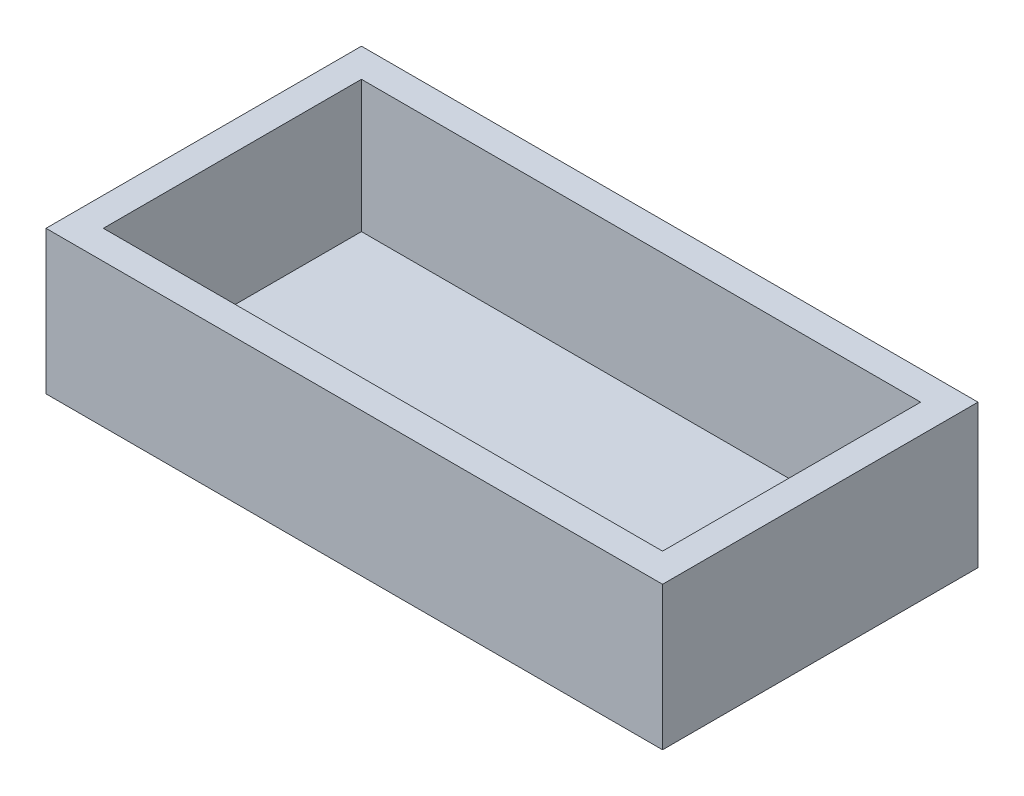
ISO-10303-21;
HEADER;
FILE_DESCRIPTION(('STEP AP214'),'2;1');
FILE_NAME('part.step','',(''),(''),'','','');
FILE_SCHEMA(('AUTOMOTIVE_DESIGN { 1 0 10303 214 1 1 1 1 }'));
ENDSEC;
DATA;
#1=APPLICATION_CONTEXT('core data for automotive mechanical design processes');
#2=APPLICATION_PROTOCOL_DEFINITION('international standard','automotive_design',2000,#1);
#3=PRODUCT_CONTEXT('',#1,'mechanical');
#4=PRODUCT('Part','Part','',(#3));
#5=PRODUCT_RELATED_PRODUCT_CATEGORY('part','',(#4));
#6=PRODUCT_DEFINITION_FORMATION('','',#4);
#7=PRODUCT_DEFINITION_CONTEXT('part definition',#1,'design');
#8=PRODUCT_DEFINITION('design','',#6,#7);
#9=PRODUCT_DEFINITION_SHAPE('','',#8);
#10=(LENGTH_UNIT() NAMED_UNIT(*) SI_UNIT(.MILLI.,.METRE.));
#11=(NAMED_UNIT(*) PLANE_ANGLE_UNIT() SI_UNIT($,.RADIAN.));
#12=(NAMED_UNIT(*) SI_UNIT($,.STERADIAN.) SOLID_ANGLE_UNIT());
#13=UNCERTAINTY_MEASURE_WITH_UNIT(LENGTH_MEASURE(1.E-05),#10,'distance_accuracy_value','');
#14=(GEOMETRIC_REPRESENTATION_CONTEXT(3) GLOBAL_UNCERTAINTY_ASSIGNED_CONTEXT((#13)) GLOBAL_UNIT_ASSIGNED_CONTEXT((#10,
#11,#12)) REPRESENTATION_CONTEXT('',''));
#15=CARTESIAN_POINT('',(0.,0.,0.));
#16=DIRECTION('',(0.,0.,1.));
#17=DIRECTION('',(1.,0.,0.));
#18=AXIS2_PLACEMENT_3D('',#15,#16,#17);
#19=CARTESIAN_POINT('',(21.5,10.,11.));
#20=DIRECTION('',(-1.,0.,0.));
#21=DIRECTION('',(0.,0.,1.));
#22=AXIS2_PLACEMENT_3D('',#19,#20,#21);
#23=PLANE('',#22);
#24=DIRECTION('',(0.,0.,-1.));
#25=VECTOR('',#24,1.);
#26=CARTESIAN_POINT('',(21.5,0.,11.));
#27=LINE('',#26,#25);
#28=CARTESIAN_POINT('',(21.5,0.,11.));
#29=VERTEX_POINT('',#28);
#30=CARTESIAN_POINT('',(21.5,0.,-11.));
#31=VERTEX_POINT('',#30);
#32=EDGE_CURVE('E180',#29,#31,#27,.T.);
#33=ORIENTED_EDGE('',*,*,#32,.T.);
#34=DIRECTION('',(0.,-1.,0.));
#35=VECTOR('',#34,1.);
#36=CARTESIAN_POINT('',(21.5,10.,-11.));
#37=LINE('',#36,#35);
#38=CARTESIAN_POINT('',(21.5,10.,-11.));
#39=VERTEX_POINT('',#38);
#40=EDGE_CURVE('E11',#39,#31,#37,.T.);
#41=ORIENTED_EDGE('',*,*,#40,.F.);
#42=DIRECTION('',(0.,0.,-1.));
#43=VECTOR('',#42,1.);
#44=CARTESIAN_POINT('',(21.5,10.,11.));
#45=LINE('',#44,#43);
#46=CARTESIAN_POINT('',(21.5,10.,11.));
#47=VERTEX_POINT('',#46);
#48=EDGE_CURVE('E188',#47,#39,#45,.T.);
#49=ORIENTED_EDGE('',*,*,#48,.F.);
#50=DIRECTION('',(0.,-1.,0.));
#51=VECTOR('',#50,1.);
#52=CARTESIAN_POINT('',(21.5,10.,11.));
#53=LINE('',#52,#51);
#54=EDGE_CURVE('E198',#47,#29,#53,.T.);
#55=ORIENTED_EDGE('',*,*,#54,.T.);
#56=EDGE_LOOP('',(#33,#41,#49,#55));
#57=FACE_BOUND('',#56,.T.);
#58=ADVANCED_FACE('F35',(#57),#23,.F.);
#59=CARTESIAN_POINT('',(-21.5,10.,-11.));
#60=DIRECTION('',(0.,0.,1.));
#61=DIRECTION('',(1.,0.,0.));
#62=AXIS2_PLACEMENT_3D('',#59,#60,#61);
#63=PLANE('',#62);
#64=DIRECTION('',(1.,0.,0.));
#65=VECTOR('',#64,1.);
#66=CARTESIAN_POINT('',(19.5,3.6,-11.));
#67=LINE('',#66,#65);
#68=CARTESIAN_POINT('',(16.3,3.6,-11.));
#69=VERTEX_POINT('',#68);
#70=CARTESIAN_POINT('',(19.5,3.6,-11.));
#71=VERTEX_POINT('',#70);
#72=EDGE_CURVE('E135',#69,#71,#67,.T.);
#73=ORIENTED_EDGE('',*,*,#72,.F.);
#74=DIRECTION('',(0.,1.,0.));
#75=VECTOR('',#74,1.);
#76=CARTESIAN_POINT('',(16.3,3.6,-11.));
#77=LINE('',#76,#75);
#78=CARTESIAN_POINT('',(16.3,2.,-11.));
#79=VERTEX_POINT('',#78);
#80=EDGE_CURVE('E49',#79,#69,#77,.T.);
#81=ORIENTED_EDGE('',*,*,#80,.F.);
#82=DIRECTION('',(-1.,0.,0.));
#83=VECTOR('',#82,1.);
#84=CARTESIAN_POINT('',(19.5,2.,-11.));
#85=LINE('',#84,#83);
#86=CARTESIAN_POINT('',(19.5,2.,-11.));
#87=VERTEX_POINT('',#86);
#88=EDGE_CURVE('E142',#87,#79,#85,.T.);
#89=ORIENTED_EDGE('',*,*,#88,.F.);
#90=DIRECTION('',(0.,-1.,0.));
#91=VECTOR('',#90,1.);
#92=CARTESIAN_POINT('',(19.5,3.6,-11.));
#93=LINE('',#92,#91);
#94=EDGE_CURVE('E128',#71,#87,#93,.T.);
#95=ORIENTED_EDGE('',*,*,#94,.F.);
#96=EDGE_LOOP('',(#73,#81,#89,#95));
#97=FACE_BOUND('',#96,.T.);
#98=DIRECTION('',(-1.,0.,0.));
#99=VECTOR('',#98,1.);
#100=CARTESIAN_POINT('',(-21.5,0.,-11.));
#101=LINE('',#100,#99);
#102=CARTESIAN_POINT('',(-21.5,0.,-11.));
#103=VERTEX_POINT('',#102);
#104=EDGE_CURVE('E201',#31,#103,#101,.T.);
#105=ORIENTED_EDGE('',*,*,#104,.T.);
#106=DIRECTION('',(0.,-1.,0.));
#107=VECTOR('',#106,1.);
#108=CARTESIAN_POINT('',(-21.5,10.,-11.));
#109=LINE('',#108,#107);
#110=CARTESIAN_POINT('',(-21.5,10.,-11.));
#111=VERTEX_POINT('',#110);
#112=EDGE_CURVE('E42',#111,#103,#109,.T.);
#113=ORIENTED_EDGE('',*,*,#112,.F.);
#114=DIRECTION('',(-1.,0.,0.));
#115=VECTOR('',#114,1.);
#116=CARTESIAN_POINT('',(-21.5,10.,-11.));
#117=LINE('',#116,#115);
#118=EDGE_CURVE('E191',#39,#111,#117,.T.);
#119=ORIENTED_EDGE('',*,*,#118,.F.);
#120=ORIENTED_EDGE('',*,*,#40,.T.);
#121=EDGE_LOOP('',(#105,#113,#119,#120));
#122=FACE_BOUND('',#121,.T.);
#123=ADVANCED_FACE('F139',(#97,#122),#63,.F.);
#124=CARTESIAN_POINT('',(-21.5,10.,11.));
#125=DIRECTION('',(1.,0.,0.));
#126=DIRECTION('',(0.,0.,-1.));
#127=AXIS2_PLACEMENT_3D('',#124,#125,#126);
#128=PLANE('',#127);
#129=DIRECTION('',(0.,0.,1.));
#130=VECTOR('',#129,1.);
#131=CARTESIAN_POINT('',(-21.5,0.,11.));
#132=LINE('',#131,#130);
#133=CARTESIAN_POINT('',(-21.5,0.,11.));
#134=VERTEX_POINT('',#133);
#135=EDGE_CURVE('E203',#103,#134,#132,.T.);
#136=ORIENTED_EDGE('',*,*,#135,.T.);
#137=DIRECTION('',(0.,-1.,0.));
#138=VECTOR('',#137,1.);
#139=CARTESIAN_POINT('',(-21.5,10.,11.));
#140=LINE('',#139,#138);
#141=CARTESIAN_POINT('',(-21.5,10.,11.));
#142=VERTEX_POINT('',#141);
#143=EDGE_CURVE('E208',#142,#134,#140,.T.);
#144=ORIENTED_EDGE('',*,*,#143,.F.);
#145=DIRECTION('',(0.,0.,1.));
#146=VECTOR('',#145,1.);
#147=CARTESIAN_POINT('',(-21.5,10.,11.));
#148=LINE('',#147,#146);
#149=EDGE_CURVE('E194',#111,#142,#148,.T.);
#150=ORIENTED_EDGE('',*,*,#149,.F.);
#151=ORIENTED_EDGE('',*,*,#112,.T.);
#152=EDGE_LOOP('',(#136,#144,#150,#151));
#153=FACE_BOUND('',#152,.T.);
#154=ADVANCED_FACE('F215',(#153),#128,.F.);
#155=CARTESIAN_POINT('',(-21.5,10.,11.));
#156=DIRECTION('',(0.,0.,-1.));
#157=DIRECTION('',(-1.,0.,0.));
#158=AXIS2_PLACEMENT_3D('',#155,#156,#157);
#159=PLANE('',#158);
#160=DIRECTION('',(1.,0.,0.));
#161=VECTOR('',#160,1.);
#162=CARTESIAN_POINT('',(-21.5,0.,11.));
#163=LINE('',#162,#161);
#164=EDGE_CURVE('E192',#134,#29,#163,.T.);
#165=ORIENTED_EDGE('',*,*,#164,.T.);
#166=ORIENTED_EDGE('',*,*,#54,.F.);
#167=DIRECTION('',(1.,0.,0.));
#168=VECTOR('',#167,1.);
#169=CARTESIAN_POINT('',(-21.5,10.,11.));
#170=LINE('',#169,#168);
#171=EDGE_CURVE('E196',#142,#47,#170,.T.);
#172=ORIENTED_EDGE('',*,*,#171,.F.);
#173=ORIENTED_EDGE('',*,*,#143,.T.);
#174=EDGE_LOOP('',(#165,#166,#172,#173));
#175=FACE_BOUND('',#174,.T.);
#176=ADVANCED_FACE('F223',(#175),#159,.F.);
#177=CARTESIAN_POINT('',(0.,10.,0.));
#178=DIRECTION('',(0.,-1.,0.));
#179=DIRECTION('',(0.,0.,-1.));
#180=AXIS2_PLACEMENT_3D('',#177,#178,#179);
#181=PLANE('',#180);
#182=DIRECTION('',(-1.,0.,0.));
#183=VECTOR('',#182,1.);
#184=CARTESIAN_POINT('',(-19.5,10.,-9.));
#185=LINE('',#184,#183);
#186=CARTESIAN_POINT('',(19.5,10.,-9.));
#187=VERTEX_POINT('',#186);
#188=CARTESIAN_POINT('',(-19.5,10.,-9.));
#189=VERTEX_POINT('',#188);
#190=EDGE_CURVE('E170',#187,#189,#185,.T.);
#191=ORIENTED_EDGE('',*,*,#190,.F.);
#192=DIRECTION('',(0.,0.,-1.));
#193=VECTOR('',#192,1.);
#194=CARTESIAN_POINT('',(19.5,10.,9.));
#195=LINE('',#194,#193);
#196=CARTESIAN_POINT('',(19.5,10.,9.));
#197=VERTEX_POINT('',#196);
#198=EDGE_CURVE('E154',#197,#187,#195,.T.);
#199=ORIENTED_EDGE('',*,*,#198,.F.);
#200=DIRECTION('',(1.,0.,0.));
#201=VECTOR('',#200,1.);
#202=CARTESIAN_POINT('',(-19.5,10.,9.));
#203=LINE('',#202,#201);
#204=CARTESIAN_POINT('',(-19.5,10.,9.));
#205=VERTEX_POINT('',#204);
#206=EDGE_CURVE('E160',#205,#197,#203,.T.);
#207=ORIENTED_EDGE('',*,*,#206,.F.);
#208=DIRECTION('',(0.,0.,1.));
#209=VECTOR('',#208,1.);
#210=CARTESIAN_POINT('',(-19.5,10.,9.));
#211=LINE('',#210,#209);
#212=EDGE_CURVE('E173',#189,#205,#211,.T.);
#213=ORIENTED_EDGE('',*,*,#212,.F.);
#214=EDGE_LOOP('',(#191,#199,#207,#213));
#215=FACE_BOUND('',#214,.T.);
#216=ORIENTED_EDGE('',*,*,#48,.T.);
#217=ORIENTED_EDGE('',*,*,#118,.T.);
#218=ORIENTED_EDGE('',*,*,#149,.T.);
#219=ORIENTED_EDGE('',*,*,#171,.T.);
#220=EDGE_LOOP('',(#216,#217,#218,#219));
#221=FACE_BOUND('',#220,.T.);
#222=ADVANCED_FACE('F229',(#215,#221),#181,.F.);
#223=CARTESIAN_POINT('',(0.,0.,0.));
#224=DIRECTION('',(0.,-1.,0.));
#225=DIRECTION('',(0.,0.,-1.));
#226=AXIS2_PLACEMENT_3D('',#223,#224,#225);
#227=PLANE('',#226);
#228=ORIENTED_EDGE('',*,*,#32,.F.);
#229=ORIENTED_EDGE('',*,*,#164,.F.);
#230=ORIENTED_EDGE('',*,*,#135,.F.);
#231=ORIENTED_EDGE('',*,*,#104,.F.);
#232=EDGE_LOOP('',(#228,#229,#230,#231));
#233=FACE_BOUND('',#232,.T.);
#234=ADVANCED_FACE('F220',(#233),#227,.T.);
#235=CARTESIAN_POINT('',(19.5,0.8,9.));
#236=DIRECTION('',(1.,0.,0.));
#237=DIRECTION('',(0.,0.,-1.));
#238=AXIS2_PLACEMENT_3D('',#235,#236,#237);
#239=PLANE('',#238);
#240=ORIENTED_EDGE('',*,*,#198,.T.);
#241=DIRECTION('',(0.,1.,0.));
#242=VECTOR('',#241,1.);
#243=CARTESIAN_POINT('',(19.5,0.8,-9.));
#244=LINE('',#243,#242);
#245=CARTESIAN_POINT('',(19.5,3.6,-9.));
#246=VERTEX_POINT('',#245);
#247=EDGE_CURVE('E130',#246,#187,#244,.T.);
#248=ORIENTED_EDGE('',*,*,#247,.F.);
#249=DIRECTION('',(0.,0.,-1.));
#250=VECTOR('',#249,1.);
#251=CARTESIAN_POINT('',(19.5,3.6,-5.42229123600034));
#252=LINE('',#251,#250);
#253=EDGE_CURVE('E57',#246,#71,#252,.T.);
#254=ORIENTED_EDGE('',*,*,#253,.T.);
#255=ORIENTED_EDGE('',*,*,#94,.T.);
#256=DIRECTION('',(0.,0.,-1.));
#257=VECTOR('',#256,1.);
#258=CARTESIAN_POINT('',(19.5,2.,-5.42229123600034));
#259=LINE('',#258,#257);
#260=CARTESIAN_POINT('',(19.5,2.,-9.));
#261=VERTEX_POINT('',#260);
#262=EDGE_CURVE('E131',#261,#87,#259,.T.);
#263=ORIENTED_EDGE('',*,*,#262,.F.);
#264=CARTESIAN_POINT('',(19.5,0.8,-9.));
#265=VERTEX_POINT('',#264);
#266=EDGE_CURVE('E185',#265,#261,#244,.T.);
#267=ORIENTED_EDGE('',*,*,#266,.F.);
#268=DIRECTION('',(0.,0.,-1.));
#269=VECTOR('',#268,1.);
#270=CARTESIAN_POINT('',(19.5,0.8,9.));
#271=LINE('',#270,#269);
#272=CARTESIAN_POINT('',(19.5,0.8,9.));
#273=VERTEX_POINT('',#272);
#274=EDGE_CURVE('E156',#273,#265,#271,.T.);
#275=ORIENTED_EDGE('',*,*,#274,.F.);
#276=DIRECTION('',(0.,1.,0.));
#277=VECTOR('',#276,1.);
#278=CARTESIAN_POINT('',(19.5,0.8,9.));
#279=LINE('',#278,#277);
#280=EDGE_CURVE('E178',#273,#197,#279,.T.);
#281=ORIENTED_EDGE('',*,*,#280,.T.);
#282=EDGE_LOOP('',(#240,#248,#254,#255,#263,#267,#275,#281));
#283=FACE_BOUND('',#282,.T.);
#284=ADVANCED_FACE('F125',(#283),#239,.F.);
#285=CARTESIAN_POINT('',(-19.5,0.8,9.));
#286=DIRECTION('',(0.,0.,1.));
#287=DIRECTION('',(1.,0.,0.));
#288=AXIS2_PLACEMENT_3D('',#285,#286,#287);
#289=PLANE('',#288);
#290=ORIENTED_EDGE('',*,*,#206,.T.);
#291=ORIENTED_EDGE('',*,*,#280,.F.);
#292=DIRECTION('',(1.,0.,0.));
#293=VECTOR('',#292,1.);
#294=CARTESIAN_POINT('',(-19.5,0.8,9.));
#295=LINE('',#294,#293);
#296=CARTESIAN_POINT('',(-19.5,0.8,9.));
#297=VERTEX_POINT('',#296);
#298=EDGE_CURVE('E166',#297,#273,#295,.T.);
#299=ORIENTED_EDGE('',*,*,#298,.F.);
#300=DIRECTION('',(0.,1.,0.));
#301=VECTOR('',#300,1.);
#302=CARTESIAN_POINT('',(-19.5,0.8,9.));
#303=LINE('',#302,#301);
#304=EDGE_CURVE('E181',#297,#205,#303,.T.);
#305=ORIENTED_EDGE('',*,*,#304,.T.);
#306=EDGE_LOOP('',(#290,#291,#299,#305));
#307=FACE_BOUND('',#306,.T.);
#308=ADVANCED_FACE('F246',(#307),#289,.F.);
#309=CARTESIAN_POINT('',(-19.5,0.8,9.));
#310=DIRECTION('',(-1.,0.,0.));
#311=DIRECTION('',(0.,0.,1.));
#312=AXIS2_PLACEMENT_3D('',#309,#310,#311);
#313=PLANE('',#312);
#314=ORIENTED_EDGE('',*,*,#212,.T.);
#315=ORIENTED_EDGE('',*,*,#304,.F.);
#316=DIRECTION('',(0.,0.,1.));
#317=VECTOR('',#316,1.);
#318=CARTESIAN_POINT('',(-19.5,0.8,9.));
#319=LINE('',#318,#317);
#320=CARTESIAN_POINT('',(-19.5,0.8,-9.));
#321=VERTEX_POINT('',#320);
#322=EDGE_CURVE('E163',#321,#297,#319,.T.);
#323=ORIENTED_EDGE('',*,*,#322,.F.);
#324=DIRECTION('',(0.,1.,0.));
#325=VECTOR('',#324,1.);
#326=CARTESIAN_POINT('',(-19.5,0.8,-9.));
#327=LINE('',#326,#325);
#328=EDGE_CURVE('E183',#321,#189,#327,.T.);
#329=ORIENTED_EDGE('',*,*,#328,.T.);
#330=EDGE_LOOP('',(#314,#315,#323,#329));
#331=FACE_BOUND('',#330,.T.);
#332=ADVANCED_FACE('F251',(#331),#313,.F.);
#333=CARTESIAN_POINT('',(-19.5,0.8,-9.));
#334=DIRECTION('',(0.,0.,-1.));
#335=DIRECTION('',(-1.,0.,0.));
#336=AXIS2_PLACEMENT_3D('',#333,#334,#335);
#337=PLANE('',#336);
#338=ORIENTED_EDGE('',*,*,#266,.T.);
#339=DIRECTION('',(1.,0.,0.));
#340=VECTOR('',#339,1.);
#341=CARTESIAN_POINT('',(19.5,2.,-9.));
#342=LINE('',#341,#340);
#343=CARTESIAN_POINT('',(16.3,2.,-9.));
#344=VERTEX_POINT('',#343);
#345=EDGE_CURVE('E149',#344,#261,#342,.T.);
#346=ORIENTED_EDGE('',*,*,#345,.F.);
#347=DIRECTION('',(0.,-1.,0.));
#348=VECTOR('',#347,1.);
#349=CARTESIAN_POINT('',(16.3,3.6,-9.));
#350=LINE('',#349,#348);
#351=CARTESIAN_POINT('',(16.3,3.6,-9.));
#352=VERTEX_POINT('',#351);
#353=EDGE_CURVE('E155',#352,#344,#350,.T.);
#354=ORIENTED_EDGE('',*,*,#353,.F.);
#355=DIRECTION('',(-1.,0.,0.));
#356=VECTOR('',#355,1.);
#357=CARTESIAN_POINT('',(19.5,3.6,-9.));
#358=LINE('',#357,#356);
#359=EDGE_CURVE('E152',#246,#352,#358,.T.);
#360=ORIENTED_EDGE('',*,*,#359,.F.);
#361=ORIENTED_EDGE('',*,*,#247,.T.);
#362=ORIENTED_EDGE('',*,*,#190,.T.);
#363=ORIENTED_EDGE('',*,*,#328,.F.);
#364=DIRECTION('',(-1.,0.,0.));
#365=VECTOR('',#364,1.);
#366=CARTESIAN_POINT('',(-19.5,0.8,-9.));
#367=LINE('',#366,#365);
#368=EDGE_CURVE('E159',#265,#321,#367,.T.);
#369=ORIENTED_EDGE('',*,*,#368,.F.);
#370=EDGE_LOOP('',(#338,#346,#354,#360,#361,#362,#363,#369));
#371=FACE_BOUND('',#370,.T.);
#372=ADVANCED_FACE('F247',(#371),#337,.F.);
#373=CARTESIAN_POINT('',(0.,0.8,0.));
#374=DIRECTION('',(0.,-1.,0.));
#375=DIRECTION('',(0.,0.,-1.));
#376=AXIS2_PLACEMENT_3D('',#373,#374,#375);
#377=PLANE('',#376);
#378=ORIENTED_EDGE('',*,*,#274,.T.);
#379=ORIENTED_EDGE('',*,*,#368,.T.);
#380=ORIENTED_EDGE('',*,*,#322,.T.);
#381=ORIENTED_EDGE('',*,*,#298,.T.);
#382=EDGE_LOOP('',(#378,#379,#380,#381));
#383=FACE_BOUND('',#382,.T.);
#384=ADVANCED_FACE('F250',(#383),#377,.F.);
#385=CARTESIAN_POINT('',(16.3,3.6,-5.42229123600034));
#386=DIRECTION('',(-1.,0.,0.));
#387=DIRECTION('',(0.,0.,1.));
#388=AXIS2_PLACEMENT_3D('',#385,#386,#387);
#389=PLANE('',#388);
#390=ORIENTED_EDGE('',*,*,#353,.T.);
#391=DIRECTION('',(0.,0.,-1.));
#392=VECTOR('',#391,1.);
#393=CARTESIAN_POINT('',(16.3,2.,-5.42229123600034));
#394=LINE('',#393,#392);
#395=EDGE_CURVE('E147',#344,#79,#394,.T.);
#396=ORIENTED_EDGE('',*,*,#395,.T.);
#397=ORIENTED_EDGE('',*,*,#80,.T.);
#398=DIRECTION('',(0.,0.,-1.));
#399=VECTOR('',#398,1.);
#400=CARTESIAN_POINT('',(16.3,3.6,-5.42229123600034));
#401=LINE('',#400,#399);
#402=EDGE_CURVE('E132',#352,#69,#401,.T.);
#403=ORIENTED_EDGE('',*,*,#402,.F.);
#404=EDGE_LOOP('',(#390,#396,#397,#403));
#405=FACE_BOUND('',#404,.T.);
#406=ADVANCED_FACE('F261',(#405),#389,.F.);
#407=CARTESIAN_POINT('',(19.5,2.,-5.42229123600034));
#408=DIRECTION('',(0.,-1.,0.));
#409=DIRECTION('',(0.,0.,-1.));
#410=AXIS2_PLACEMENT_3D('',#407,#408,#409);
#411=PLANE('',#410);
#412=ORIENTED_EDGE('',*,*,#345,.T.);
#413=ORIENTED_EDGE('',*,*,#262,.T.);
#414=ORIENTED_EDGE('',*,*,#88,.T.);
#415=ORIENTED_EDGE('',*,*,#395,.F.);
#416=EDGE_LOOP('',(#412,#413,#414,#415));
#417=FACE_BOUND('',#416,.T.);
#418=ADVANCED_FACE('F265',(#417),#411,.F.);
#419=CARTESIAN_POINT('',(19.5,3.6,-5.42229123600034));
#420=DIRECTION('',(0.,1.,0.));
#421=DIRECTION('',(0.,0.,1.));
#422=AXIS2_PLACEMENT_3D('',#419,#420,#421);
#423=PLANE('',#422);
#424=ORIENTED_EDGE('',*,*,#359,.T.);
#425=ORIENTED_EDGE('',*,*,#402,.T.);
#426=ORIENTED_EDGE('',*,*,#72,.T.);
#427=ORIENTED_EDGE('',*,*,#253,.F.);
#428=EDGE_LOOP('',(#424,#425,#426,#427));
#429=FACE_BOUND('',#428,.T.);
#430=ADVANCED_FACE('F136',(#429),#423,.F.);
#431=CLOSED_SHELL('',(#58,#123,#154,#176,#222,#234,#284,#308,#332,#372,#384,#406,#418,#430));
#432=MANIFOLD_SOLID_BREP('B2',#431);
#433=ADVANCED_BREP_SHAPE_REPRESENTATION('',(#18,#432),#14);
#434=SHAPE_DEFINITION_REPRESENTATION(#9,#433);
ENDSEC;
END-ISO-10303-21;
